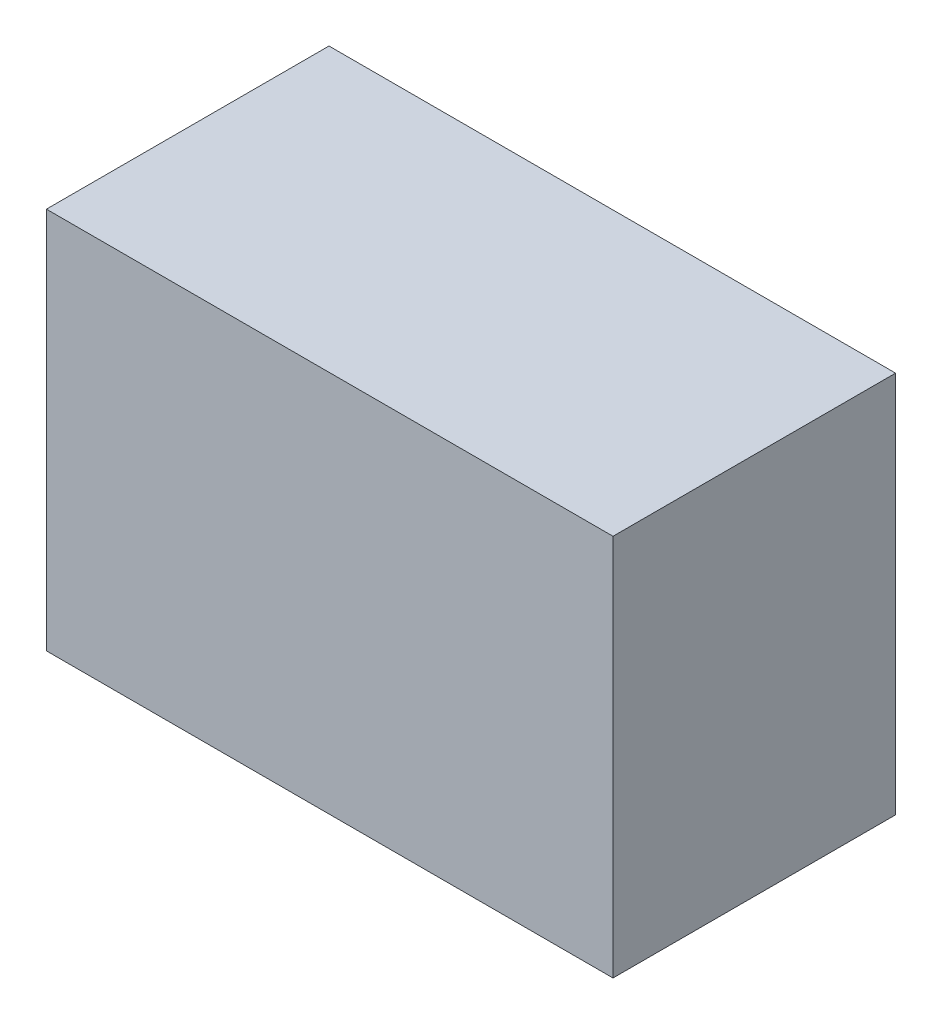
ISO-10303-21;
HEADER;
FILE_DESCRIPTION(('STEP AP214'),'2;1');
FILE_NAME('part.step','',(''),(''),'','','');
FILE_SCHEMA(('AUTOMOTIVE_DESIGN { 1 0 10303 214 1 1 1 1 }'));
ENDSEC;
DATA;
#1=APPLICATION_CONTEXT('core data for automotive mechanical design processes');
#2=APPLICATION_PROTOCOL_DEFINITION('international standard','automotive_design',2000,#1);
#3=PRODUCT_CONTEXT('',#1,'mechanical');
#4=PRODUCT('Part','Part','',(#3));
#5=PRODUCT_RELATED_PRODUCT_CATEGORY('part','',(#4));
#6=PRODUCT_DEFINITION_FORMATION('','',#4);
#7=PRODUCT_DEFINITION_CONTEXT('part definition',#1,'design');
#8=PRODUCT_DEFINITION('design','',#6,#7);
#9=PRODUCT_DEFINITION_SHAPE('','',#8);
#10=(LENGTH_UNIT() NAMED_UNIT(*) SI_UNIT(.MILLI.,.METRE.));
#11=(NAMED_UNIT(*) PLANE_ANGLE_UNIT() SI_UNIT($,.RADIAN.));
#12=(NAMED_UNIT(*) SI_UNIT($,.STERADIAN.) SOLID_ANGLE_UNIT());
#13=UNCERTAINTY_MEASURE_WITH_UNIT(LENGTH_MEASURE(1.E-05),#10,'distance_accuracy_value','');
#14=(GEOMETRIC_REPRESENTATION_CONTEXT(3) GLOBAL_UNCERTAINTY_ASSIGNED_CONTEXT((#13)) GLOBAL_UNIT_ASSIGNED_CONTEXT((#10,
#11,#12)) REPRESENTATION_CONTEXT('',''));
#15=CARTESIAN_POINT('',(0.,0.,0.));
#16=DIRECTION('',(0.,0.,1.));
#17=DIRECTION('',(1.,0.,0.));
#18=AXIS2_PLACEMENT_3D('',#15,#16,#17);
#19=CARTESIAN_POINT('',(-1.3699998,3.9099998,3.8999922));
#20=DIRECTION('',(1.,0.,0.));
#21=DIRECTION('',(0.,0.,-1.));
#22=AXIS2_PLACEMENT_3D('',#19,#20,#21);
#23=PLANE('',#22);
#24=DIRECTION('',(0.,-1.,0.));
#25=VECTOR('',#24,1.);
#26=CARTESIAN_POINT('',(-1.3699998,3.9099998,0.));
#27=LINE('',#26,#25);
#28=CARTESIAN_POINT('',(-1.3699998,3.9099998,0.));
#29=VERTEX_POINT('',#28);
#30=CARTESIAN_POINT('',(-1.3699998,-1.3699998,0.));
#31=VERTEX_POINT('',#30);
#32=EDGE_CURVE('E95',#29,#31,#27,.T.);
#33=ORIENTED_EDGE('',*,*,#32,.T.);
#34=DIRECTION('',(0.,0.,-1.));
#35=VECTOR('',#34,1.);
#36=CARTESIAN_POINT('',(-1.3699998,-1.3699998,3.8999922));
#37=LINE('',#36,#35);
#38=CARTESIAN_POINT('',(-1.3699998,-1.3699998,3.8999922));
#39=VERTEX_POINT('',#38);
#40=EDGE_CURVE('E11',#39,#31,#37,.T.);
#41=ORIENTED_EDGE('',*,*,#40,.F.);
#42=DIRECTION('',(0.,-1.,0.));
#43=VECTOR('',#42,1.);
#44=CARTESIAN_POINT('',(-1.3699998,3.9099998,3.8999922));
#45=LINE('',#44,#43);
#46=CARTESIAN_POINT('',(-1.3699998,3.9099998,3.8999922));
#47=VERTEX_POINT('',#46);
#48=EDGE_CURVE('E83',#47,#39,#45,.T.);
#49=ORIENTED_EDGE('',*,*,#48,.F.);
#50=DIRECTION('',(0.,0.,-1.));
#51=VECTOR('',#50,1.);
#52=CARTESIAN_POINT('',(-1.3699998,3.9099998,3.8999922));
#53=LINE('',#52,#51);
#54=EDGE_CURVE('E91',#47,#29,#53,.T.);
#55=ORIENTED_EDGE('',*,*,#54,.T.);
#56=EDGE_LOOP('',(#33,#41,#49,#55));
#57=FACE_BOUND('',#56,.T.);
#58=ADVANCED_FACE('F32',(#57),#23,.F.);
#59=CARTESIAN_POINT('',(-1.3699998,-1.3699998,3.8999922));
#60=DIRECTION('',(0.,1.,0.));
#61=DIRECTION('',(0.,0.,1.));
#62=AXIS2_PLACEMENT_3D('',#59,#60,#61);
#63=PLANE('',#62);
#64=DIRECTION('',(1.,0.,0.));
#65=VECTOR('',#64,1.);
#66=CARTESIAN_POINT('',(-1.3699998,-1.3699998,0.));
#67=LINE('',#66,#65);
#68=CARTESIAN_POINT('',(6.4499998,-1.3699998,0.));
#69=VERTEX_POINT('',#68);
#70=EDGE_CURVE('E87',#31,#69,#67,.T.);
#71=ORIENTED_EDGE('',*,*,#70,.T.);
#72=DIRECTION('',(0.,0.,-1.));
#73=VECTOR('',#72,1.);
#74=CARTESIAN_POINT('',(6.4499998,-1.3699998,3.8999922));
#75=LINE('',#74,#73);
#76=CARTESIAN_POINT('',(6.4499998,-1.3699998,3.8999922));
#77=VERTEX_POINT('',#76);
#78=EDGE_CURVE('E40',#77,#69,#75,.T.);
#79=ORIENTED_EDGE('',*,*,#78,.F.);
#80=DIRECTION('',(1.,0.,0.));
#81=VECTOR('',#80,1.);
#82=CARTESIAN_POINT('',(-1.3699998,-1.3699998,3.8999922));
#83=LINE('',#82,#81);
#84=EDGE_CURVE('E78',#39,#77,#83,.T.);
#85=ORIENTED_EDGE('',*,*,#84,.F.);
#86=ORIENTED_EDGE('',*,*,#40,.T.);
#87=EDGE_LOOP('',(#71,#79,#85,#86));
#88=FACE_BOUND('',#87,.T.);
#89=ADVANCED_FACE('F86',(#88),#63,.F.);
#90=CARTESIAN_POINT('',(6.4499998,-1.3699998,3.8999922));
#91=DIRECTION('',(-1.,0.,0.));
#92=DIRECTION('',(0.,0.,1.));
#93=AXIS2_PLACEMENT_3D('',#90,#91,#92);
#94=PLANE('',#93);
#95=DIRECTION('',(0.,1.,0.));
#96=VECTOR('',#95,1.);
#97=CARTESIAN_POINT('',(6.4499998,-1.3699998,0.));
#98=LINE('',#97,#96);
#99=CARTESIAN_POINT('',(6.4499998,3.9099998,0.));
#100=VERTEX_POINT('',#99);
#101=EDGE_CURVE('E65',#69,#100,#98,.T.);
#102=ORIENTED_EDGE('',*,*,#101,.T.);
#103=DIRECTION('',(0.,0.,-1.));
#104=VECTOR('',#103,1.);
#105=CARTESIAN_POINT('',(6.4499998,3.9099998,3.8999922));
#106=LINE('',#105,#104);
#107=CARTESIAN_POINT('',(6.4499998,3.9099998,3.8999922));
#108=VERTEX_POINT('',#107);
#109=EDGE_CURVE('E88',#108,#100,#106,.T.);
#110=ORIENTED_EDGE('',*,*,#109,.F.);
#111=DIRECTION('',(0.,1.,0.));
#112=VECTOR('',#111,1.);
#113=CARTESIAN_POINT('',(6.4499998,-1.3699998,3.8999922));
#114=LINE('',#113,#112);
#115=EDGE_CURVE('E81',#77,#108,#114,.T.);
#116=ORIENTED_EDGE('',*,*,#115,.F.);
#117=ORIENTED_EDGE('',*,*,#78,.T.);
#118=EDGE_LOOP('',(#102,#110,#116,#117));
#119=FACE_BOUND('',#118,.T.);
#120=ADVANCED_FACE('F89',(#119),#94,.F.);
#121=CARTESIAN_POINT('',(6.4499998,3.9099998,3.8999922));
#122=DIRECTION('',(0.,-1.,0.));
#123=DIRECTION('',(0.,0.,-1.));
#124=AXIS2_PLACEMENT_3D('',#121,#122,#123);
#125=PLANE('',#124);
#126=DIRECTION('',(-1.,0.,0.));
#127=VECTOR('',#126,1.);
#128=CARTESIAN_POINT('',(6.4499998,3.9099998,0.));
#129=LINE('',#128,#127);
#130=EDGE_CURVE('E71',#100,#29,#129,.T.);
#131=ORIENTED_EDGE('',*,*,#130,.T.);
#132=ORIENTED_EDGE('',*,*,#54,.F.);
#133=DIRECTION('',(-1.,0.,0.));
#134=VECTOR('',#133,1.);
#135=CARTESIAN_POINT('',(6.4499998,3.9099998,3.8999922));
#136=LINE('',#135,#134);
#137=EDGE_CURVE('E48',#108,#47,#136,.T.);
#138=ORIENTED_EDGE('',*,*,#137,.F.);
#139=ORIENTED_EDGE('',*,*,#109,.T.);
#140=EDGE_LOOP('',(#131,#132,#138,#139));
#141=FACE_BOUND('',#140,.T.);
#142=ADVANCED_FACE('F102',(#141),#125,.F.);
#143=CARTESIAN_POINT('',(0.,0.,3.8999922));
#144=DIRECTION('',(0.,0.,1.));
#145=DIRECTION('',(1.,0.,0.));
#146=AXIS2_PLACEMENT_3D('',#143,#144,#145);
#147=PLANE('',#146);
#148=ORIENTED_EDGE('',*,*,#48,.T.);
#149=ORIENTED_EDGE('',*,*,#84,.T.);
#150=ORIENTED_EDGE('',*,*,#115,.T.);
#151=ORIENTED_EDGE('',*,*,#137,.T.);
#152=EDGE_LOOP('',(#148,#149,#150,#151));
#153=FACE_BOUND('',#152,.T.);
#154=ADVANCED_FACE('F79',(#153),#147,.T.);
#155=CARTESIAN_POINT('',(0.,0.,0.));
#156=DIRECTION('',(0.,0.,1.));
#157=DIRECTION('',(1.,0.,0.));
#158=AXIS2_PLACEMENT_3D('',#155,#156,#157);
#159=PLANE('',#158);
#160=ORIENTED_EDGE('',*,*,#32,.F.);
#161=ORIENTED_EDGE('',*,*,#130,.F.);
#162=ORIENTED_EDGE('',*,*,#101,.F.);
#163=ORIENTED_EDGE('',*,*,#70,.F.);
#164=EDGE_LOOP('',(#160,#161,#162,#163));
#165=FACE_BOUND('',#164,.T.);
#166=ADVANCED_FACE('F105',(#165),#159,.F.);
#167=CLOSED_SHELL('',(#58,#89,#120,#142,#154,#166));
#168=MANIFOLD_SOLID_BREP('B2',#167);
#169=ADVANCED_BREP_SHAPE_REPRESENTATION('',(#18,#168),#14);
#170=SHAPE_DEFINITION_REPRESENTATION(#9,#169);
ENDSEC;
END-ISO-10303-21;
